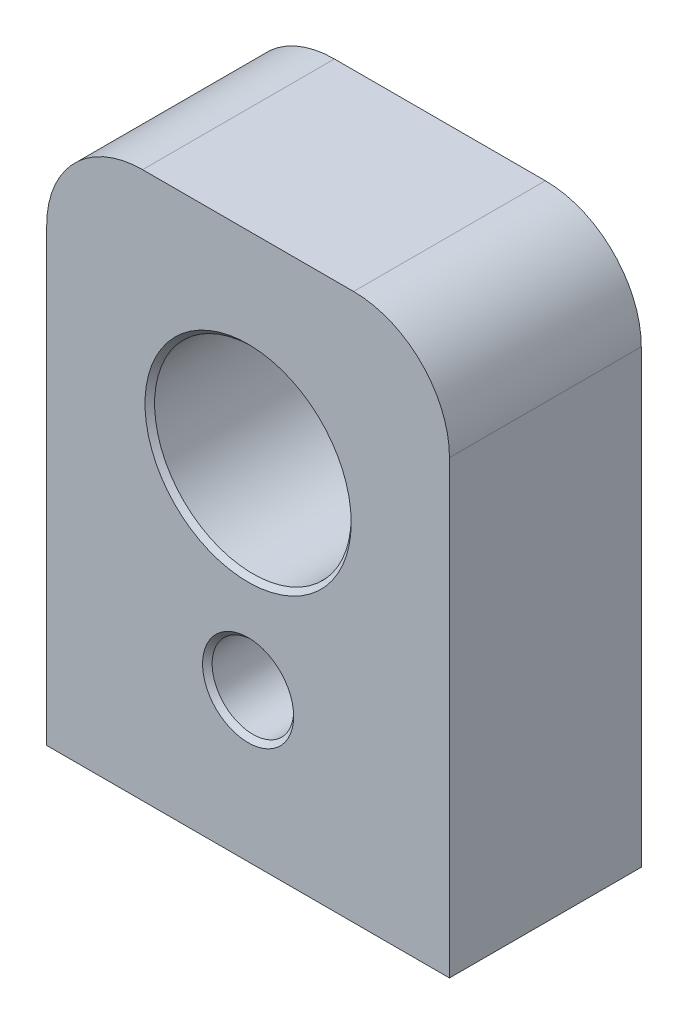
ISO-10303-21;
HEADER;
FILE_DESCRIPTION(('STEP AP214'),'2;1');
FILE_NAME('part.step','',(''),(''),'','','');
FILE_SCHEMA(('AUTOMOTIVE_DESIGN { 1 0 10303 214 1 1 1 1 }'));
ENDSEC;
DATA;
#1=APPLICATION_CONTEXT('core data for automotive mechanical design processes');
#2=APPLICATION_PROTOCOL_DEFINITION('international standard','automotive_design',2000,#1);
#3=PRODUCT_CONTEXT('',#1,'mechanical');
#4=PRODUCT('Part','Part','',(#3));
#5=PRODUCT_RELATED_PRODUCT_CATEGORY('part','',(#4));
#6=PRODUCT_DEFINITION_FORMATION('','',#4);
#7=PRODUCT_DEFINITION_CONTEXT('part definition',#1,'design');
#8=PRODUCT_DEFINITION('design','',#6,#7);
#9=PRODUCT_DEFINITION_SHAPE('','',#8);
#10=(LENGTH_UNIT() NAMED_UNIT(*) SI_UNIT(.MILLI.,.METRE.));
#11=(NAMED_UNIT(*) PLANE_ANGLE_UNIT() SI_UNIT($,.RADIAN.));
#12=(NAMED_UNIT(*) SI_UNIT($,.STERADIAN.) SOLID_ANGLE_UNIT());
#13=UNCERTAINTY_MEASURE_WITH_UNIT(LENGTH_MEASURE(1.E-05),#10,'distance_accuracy_value','');
#14=(GEOMETRIC_REPRESENTATION_CONTEXT(3) GLOBAL_UNCERTAINTY_ASSIGNED_CONTEXT((#13)) GLOBAL_UNIT_ASSIGNED_CONTEXT((#10,
#11,#12)) REPRESENTATION_CONTEXT('',''));
#15=CARTESIAN_POINT('',(0.,0.,0.));
#16=DIRECTION('',(0.,0.,1.));
#17=DIRECTION('',(1.,0.,0.));
#18=AXIS2_PLACEMENT_3D('',#15,#16,#17);
#19=CARTESIAN_POINT('',(-39.4448964809703,-26.519347405762,-10.));
#20=DIRECTION('',(0.,-1.,0.));
#21=DIRECTION('',(0.,0.,-1.));
#22=AXIS2_PLACEMENT_3D('',#19,#20,#21);
#23=PLANE('',#22);
#24=DIRECTION('',(1.,0.,0.));
#25=VECTOR('',#24,1.);
#26=CARTESIAN_POINT('',(-39.4448964809703,-26.519347405762,10.));
#27=LINE('',#26,#25);
#28=CARTESIAN_POINT('',(-39.4448964809703,-26.519347405762,10.));
#29=VERTEX_POINT('',#28);
#30=CARTESIAN_POINT('',(2.55510351902972,-26.519347405762,10.));
#31=VERTEX_POINT('',#30);
#32=EDGE_CURVE('E124',#29,#31,#27,.T.);
#33=ORIENTED_EDGE('',*,*,#32,.F.);
#34=DIRECTION('',(0.,0.,1.));
#35=VECTOR('',#34,1.);
#36=CARTESIAN_POINT('',(-39.4448964809703,-26.519347405762,-10.));
#37=LINE('',#36,#35);
#38=CARTESIAN_POINT('',(-39.4448964809703,-26.519347405762,-10.));
#39=VERTEX_POINT('',#38);
#40=EDGE_CURVE('E53',#39,#29,#37,.T.);
#41=ORIENTED_EDGE('',*,*,#40,.F.);
#42=DIRECTION('',(1.,0.,0.));
#43=VECTOR('',#42,1.);
#44=CARTESIAN_POINT('',(-39.4448964809703,-26.519347405762,-10.));
#45=LINE('',#44,#43);
#46=CARTESIAN_POINT('',(2.55510351902972,-26.519347405762,-10.));
#47=VERTEX_POINT('',#46);
#48=EDGE_CURVE('E139',#39,#47,#45,.T.);
#49=ORIENTED_EDGE('',*,*,#48,.T.);
#50=DIRECTION('',(0.,0.,1.));
#51=VECTOR('',#50,1.);
#52=CARTESIAN_POINT('',(2.55510351902972,-26.519347405762,-10.));
#53=LINE('',#52,#51);
#54=EDGE_CURVE('E88',#47,#31,#53,.T.);
#55=ORIENTED_EDGE('',*,*,#54,.T.);
#56=EDGE_LOOP('',(#33,#41,#49,#55));
#57=FACE_BOUND('',#56,.T.);
#58=ADVANCED_FACE('F35',(#57),#23,.T.);
#59=CARTESIAN_POINT('',(-39.4448964809704,20.4806525942305,-10.));
#60=DIRECTION('',(-1.,0.,0.));
#61=DIRECTION('',(0.,-1.,0.));
#62=AXIS2_PLACEMENT_3D('',#59,#60,#61);
#63=PLANE('',#62);
#64=DIRECTION('',(0.,-1.,0.));
#65=VECTOR('',#64,1.);
#66=CARTESIAN_POINT('',(-39.4448964809704,20.4806525942305,10.));
#67=LINE('',#66,#65);
#68=CARTESIAN_POINT('',(-39.4448964809704,20.4806525942305,10.));
#69=VERTEX_POINT('',#68);
#70=EDGE_CURVE('E136',#69,#29,#67,.T.);
#71=ORIENTED_EDGE('',*,*,#70,.F.);
#72=DIRECTION('',(0.,0.,1.));
#73=VECTOR('',#72,1.);
#74=CARTESIAN_POINT('',(-39.4448964809704,20.4806525942305,-10.));
#75=LINE('',#74,#73);
#76=CARTESIAN_POINT('',(-39.4448964809704,20.4806525942305,-10.));
#77=VERTEX_POINT('',#76);
#78=EDGE_CURVE('E76',#77,#69,#75,.T.);
#79=ORIENTED_EDGE('',*,*,#78,.F.);
#80=DIRECTION('',(0.,-1.,0.));
#81=VECTOR('',#80,1.);
#82=CARTESIAN_POINT('',(-39.4448964809704,20.4806525942305,-10.));
#83=LINE('',#82,#81);
#84=EDGE_CURVE('E114',#77,#39,#83,.T.);
#85=ORIENTED_EDGE('',*,*,#84,.T.);
#86=ORIENTED_EDGE('',*,*,#40,.T.);
#87=EDGE_LOOP('',(#71,#79,#85,#86));
#88=FACE_BOUND('',#87,.T.);
#89=ADVANCED_FACE('F204',(#88),#63,.T.);
#90=CARTESIAN_POINT('',(-29.4448964809704,20.4806525942305,-10.));
#91=DIRECTION('',(0.,0.,1.));
#92=DIRECTION('',(1.,0.,0.));
#93=AXIS2_PLACEMENT_3D('',#90,#91,#92);
#94=CYLINDRICAL_SURFACE('',#93,10.);
#95=CARTESIAN_POINT('',(-29.4448964809704,20.4806525942305,10.));
#96=DIRECTION('',(0.,0.,1.));
#97=DIRECTION('',(-1.,0.,0.));
#98=AXIS2_PLACEMENT_3D('',#95,#96,#97);
#99=CIRCLE('',#98,10.);
#100=CARTESIAN_POINT('',(-29.4448964809704,30.4806525942305,10.));
#101=VERTEX_POINT('',#100);
#102=EDGE_CURVE('E101',#101,#69,#99,.T.);
#103=ORIENTED_EDGE('',*,*,#102,.F.);
#104=DIRECTION('',(0.,0.,1.));
#105=VECTOR('',#104,1.);
#106=CARTESIAN_POINT('',(-29.4448964809704,30.4806525942305,-10.));
#107=LINE('',#106,#105);
#108=CARTESIAN_POINT('',(-29.4448964809704,30.4806525942305,-10.));
#109=VERTEX_POINT('',#108);
#110=EDGE_CURVE('E96',#109,#101,#107,.T.);
#111=ORIENTED_EDGE('',*,*,#110,.F.);
#112=CARTESIAN_POINT('',(-29.4448964809704,20.4806525942305,-10.));
#113=DIRECTION('',(0.,0.,1.));
#114=DIRECTION('',(-1.,0.,0.));
#115=AXIS2_PLACEMENT_3D('',#112,#113,#114);
#116=CIRCLE('',#115,10.);
#117=EDGE_CURVE('E99',#109,#77,#116,.T.);
#118=ORIENTED_EDGE('',*,*,#117,.T.);
#119=ORIENTED_EDGE('',*,*,#78,.T.);
#120=EDGE_LOOP('',(#103,#111,#118,#119));
#121=FACE_BOUND('',#120,.T.);
#122=ADVANCED_FACE('F98',(#121),#94,.T.);
#123=CARTESIAN_POINT('',(-7.44489648097042,30.4806525942305,-10.));
#124=DIRECTION('',(0.,1.,0.));
#125=DIRECTION('',(0.,0.,1.));
#126=AXIS2_PLACEMENT_3D('',#123,#124,#125);
#127=PLANE('',#126);
#128=DIRECTION('',(-1.,0.,0.));
#129=VECTOR('',#128,1.);
#130=CARTESIAN_POINT('',(-7.44489648097042,30.4806525942305,10.));
#131=LINE('',#130,#129);
#132=CARTESIAN_POINT('',(-7.44489648097042,30.4806525942305,10.));
#133=VERTEX_POINT('',#132);
#134=EDGE_CURVE('E133',#133,#101,#131,.T.);
#135=ORIENTED_EDGE('',*,*,#134,.F.);
#136=DIRECTION('',(0.,0.,1.));
#137=VECTOR('',#136,1.);
#138=CARTESIAN_POINT('',(-7.44489648097042,30.4806525942305,-10.));
#139=LINE('',#138,#137);
#140=CARTESIAN_POINT('',(-7.44489648097042,30.4806525942305,-10.));
#141=VERTEX_POINT('',#140);
#142=EDGE_CURVE('E106',#141,#133,#139,.T.);
#143=ORIENTED_EDGE('',*,*,#142,.F.);
#144=DIRECTION('',(-1.,0.,0.));
#145=VECTOR('',#144,1.);
#146=CARTESIAN_POINT('',(-7.44489648097042,30.4806525942305,-10.));
#147=LINE('',#146,#145);
#148=EDGE_CURVE('E112',#141,#109,#147,.T.);
#149=ORIENTED_EDGE('',*,*,#148,.T.);
#150=ORIENTED_EDGE('',*,*,#110,.T.);
#151=EDGE_LOOP('',(#135,#143,#149,#150));
#152=FACE_BOUND('',#151,.T.);
#153=ADVANCED_FACE('F116',(#152),#127,.T.);
#154=CARTESIAN_POINT('',(-7.44489648097042,20.4806525942305,-10.));
#155=DIRECTION('',(0.,0.,1.));
#156=DIRECTION('',(1.,0.,0.));
#157=AXIS2_PLACEMENT_3D('',#154,#155,#156);
#158=CYLINDRICAL_SURFACE('',#157,10.);
#159=CARTESIAN_POINT('',(-7.44489648097042,20.4806525942305,10.));
#160=DIRECTION('',(0.,0.,1.));
#161=DIRECTION('',(1.,0.,0.));
#162=AXIS2_PLACEMENT_3D('',#159,#160,#161);
#163=CIRCLE('',#162,10.);
#164=CARTESIAN_POINT('',(2.55510351902959,20.4806525942305,10.));
#165=VERTEX_POINT('',#164);
#166=EDGE_CURVE('E130',#165,#133,#163,.T.);
#167=ORIENTED_EDGE('',*,*,#166,.F.);
#168=DIRECTION('',(0.,0.,1.));
#169=VECTOR('',#168,1.);
#170=CARTESIAN_POINT('',(2.55510351902959,20.4806525942305,-10.));
#171=LINE('',#170,#169);
#172=CARTESIAN_POINT('',(2.55510351902959,20.4806525942305,-10.));
#173=VERTEX_POINT('',#172);
#174=EDGE_CURVE('E144',#173,#165,#171,.T.);
#175=ORIENTED_EDGE('',*,*,#174,.F.);
#176=CARTESIAN_POINT('',(-7.44489648097042,20.4806525942305,-10.));
#177=DIRECTION('',(0.,0.,1.));
#178=DIRECTION('',(1.,0.,0.));
#179=AXIS2_PLACEMENT_3D('',#176,#177,#178);
#180=CIRCLE('',#179,10.);
#181=EDGE_CURVE('E117',#173,#141,#180,.T.);
#182=ORIENTED_EDGE('',*,*,#181,.T.);
#183=ORIENTED_EDGE('',*,*,#142,.T.);
#184=EDGE_LOOP('',(#167,#175,#182,#183));
#185=FACE_BOUND('',#184,.T.);
#186=ADVANCED_FACE('F223',(#185),#158,.T.);
#187=CARTESIAN_POINT('',(2.55510351902972,-26.519347405762,-10.));
#188=DIRECTION('',(1.,0.,0.));
#189=DIRECTION('',(0.,1.,0.));
#190=AXIS2_PLACEMENT_3D('',#187,#188,#189);
#191=PLANE('',#190);
#192=DIRECTION('',(0.,1.,0.));
#193=VECTOR('',#192,1.);
#194=CARTESIAN_POINT('',(2.55510351902972,-26.519347405762,10.));
#195=LINE('',#194,#193);
#196=EDGE_CURVE('E127',#31,#165,#195,.T.);
#197=ORIENTED_EDGE('',*,*,#196,.F.);
#198=ORIENTED_EDGE('',*,*,#54,.F.);
#199=DIRECTION('',(0.,1.,0.));
#200=VECTOR('',#199,1.);
#201=CARTESIAN_POINT('',(2.55510351902972,-26.519347405762,-10.));
#202=LINE('',#201,#200);
#203=EDGE_CURVE('E119',#47,#173,#202,.T.);
#204=ORIENTED_EDGE('',*,*,#203,.T.);
#205=ORIENTED_EDGE('',*,*,#174,.T.);
#206=EDGE_LOOP('',(#197,#198,#204,#205));
#207=FACE_BOUND('',#206,.T.);
#208=ADVANCED_FACE('F188',(#207),#191,.T.);
#209=CARTESIAN_POINT('',(-7.44489648097042,20.4806525942305,-10.));
#210=DIRECTION('',(0.,0.,1.));
#211=DIRECTION('',(1.,0.,0.));
#212=AXIS2_PLACEMENT_3D('',#209,#210,#211);
#213=PLANE('',#212);
#214=CARTESIAN_POINT('',(-18.4448964809706,-11.0193474057693,-10.));
#215=DIRECTION('',(0.,0.,1.));
#216=DIRECTION('',(1.,0.,0.));
#217=AXIS2_PLACEMENT_3D('',#214,#215,#216);
#218=CIRCLE('',#217,4.75000000000001);
#219=CARTESIAN_POINT('',(-13.6948964809706,-11.0193474057693,-10.));
#220=VERTEX_POINT('',#219);
#221=EDGE_CURVE('E11',#220,#220,#218,.T.);
#222=ORIENTED_EDGE('',*,*,#221,.T.);
#223=EDGE_LOOP('',(#222));
#224=FACE_BOUND('',#223,.T.);
#225=CARTESIAN_POINT('',(-18.4448964809706,9.48065259423065,-10.));
#226=DIRECTION('',(0.,0.,1.));
#227=DIRECTION('',(1.,0.,0.));
#228=AXIS2_PLACEMENT_3D('',#225,#226,#227);
#229=CIRCLE('',#228,10.75);
#230=CARTESIAN_POINT('',(-7.69489648097064,9.48065259423065,-10.));
#231=VERTEX_POINT('',#230);
#232=EDGE_CURVE('E155',#231,#231,#229,.T.);
#233=ORIENTED_EDGE('',*,*,#232,.T.);
#234=EDGE_LOOP('',(#233));
#235=FACE_BOUND('',#234,.T.);
#236=ORIENTED_EDGE('',*,*,#48,.F.);
#237=ORIENTED_EDGE('',*,*,#84,.F.);
#238=ORIENTED_EDGE('',*,*,#117,.F.);
#239=ORIENTED_EDGE('',*,*,#148,.F.);
#240=ORIENTED_EDGE('',*,*,#181,.F.);
#241=ORIENTED_EDGE('',*,*,#203,.F.);
#242=EDGE_LOOP('',(#236,#237,#238,#239,#240,#241));
#243=FACE_BOUND('',#242,.T.);
#244=ADVANCED_FACE('F110',(#224,#235,#243),#213,.F.);
#245=CARTESIAN_POINT('',(-7.44489648097042,20.4806525942305,10.));
#246=DIRECTION('',(0.,0.,1.));
#247=DIRECTION('',(1.,0.,0.));
#248=AXIS2_PLACEMENT_3D('',#245,#246,#247);
#249=PLANE('',#248);
#250=CARTESIAN_POINT('',(-18.4448964809706,-11.0193474057693,10.));
#251=DIRECTION('',(0.,0.,1.));
#252=DIRECTION('',(1.,0.,0.));
#253=AXIS2_PLACEMENT_3D('',#250,#251,#252);
#254=CIRCLE('',#253,4.75);
#255=CARTESIAN_POINT('',(-13.6948964809706,-11.0193474057693,10.));
#256=VERTEX_POINT('',#255);
#257=EDGE_CURVE('E45',#256,#256,#254,.F.);
#258=ORIENTED_EDGE('',*,*,#257,.T.);
#259=EDGE_LOOP('',(#258));
#260=FACE_BOUND('',#259,.T.);
#261=CARTESIAN_POINT('',(-18.4448964809706,9.48065259423065,10.));
#262=DIRECTION('',(0.,0.,1.));
#263=DIRECTION('',(1.,0.,0.));
#264=AXIS2_PLACEMENT_3D('',#261,#262,#263);
#265=CIRCLE('',#264,10.75);
#266=CARTESIAN_POINT('',(-7.69489648097063,9.48065259423065,10.));
#267=VERTEX_POINT('',#266);
#268=EDGE_CURVE('E152',#267,#267,#265,.F.);
#269=ORIENTED_EDGE('',*,*,#268,.T.);
#270=EDGE_LOOP('',(#269));
#271=FACE_BOUND('',#270,.T.);
#272=ORIENTED_EDGE('',*,*,#32,.T.);
#273=ORIENTED_EDGE('',*,*,#196,.T.);
#274=ORIENTED_EDGE('',*,*,#166,.T.);
#275=ORIENTED_EDGE('',*,*,#134,.T.);
#276=ORIENTED_EDGE('',*,*,#102,.T.);
#277=ORIENTED_EDGE('',*,*,#70,.T.);
#278=EDGE_LOOP('',(#272,#273,#274,#275,#276,#277));
#279=FACE_BOUND('',#278,.T.);
#280=ADVANCED_FACE('F166',(#260,#271,#279),#249,.T.);
#281=CARTESIAN_POINT('',(-18.4448964809706,-11.0193474057693,-10.));
#282=DIRECTION('',(0.,0.,1.));
#283=DIRECTION('',(1.,0.,0.));
#284=AXIS2_PLACEMENT_3D('',#281,#282,#283);
#285=CYLINDRICAL_SURFACE('',#284,4.25);
#286=CARTESIAN_POINT('',(-18.4448964809706,-11.0193474057693,9.50000000000002));
#287=DIRECTION('',(0.,0.,1.));
#288=DIRECTION('',(1.,0.,0.));
#289=AXIS2_PLACEMENT_3D('',#286,#287,#288);
#290=CIRCLE('',#289,4.25);
#291=CARTESIAN_POINT('',(-14.1948964809706,-11.0193474057693,9.50000000000002));
#292=VERTEX_POINT('',#291);
#293=EDGE_CURVE('E161',#292,#292,#290,.T.);
#294=ORIENTED_EDGE('',*,*,#293,.T.);
#295=EDGE_LOOP('',(#294));
#296=FACE_BOUND('',#295,.T.);
#297=CARTESIAN_POINT('',(-18.4448964809706,-11.0193474057693,-9.49999999999999));
#298=DIRECTION('',(0.,0.,1.));
#299=DIRECTION('',(1.,0.,0.));
#300=AXIS2_PLACEMENT_3D('',#297,#298,#299);
#301=CIRCLE('',#300,4.25);
#302=CARTESIAN_POINT('',(-14.1948964809706,-11.0193474057693,-9.49999999999999));
#303=VERTEX_POINT('',#302);
#304=EDGE_CURVE('E158',#303,#303,#301,.F.);
#305=ORIENTED_EDGE('',*,*,#304,.T.);
#306=EDGE_LOOP('',(#305));
#307=FACE_BOUND('',#306,.T.);
#308=ADVANCED_FACE('F175',(#296,#307),#285,.F.);
#309=CARTESIAN_POINT('',(-18.4448964809706,9.48065259423065,-10.));
#310=DIRECTION('',(0.,0.,1.));
#311=DIRECTION('',(1.,0.,0.));
#312=AXIS2_PLACEMENT_3D('',#309,#310,#311);
#313=CYLINDRICAL_SURFACE('',#312,10.25);
#314=CARTESIAN_POINT('',(-18.4448964809706,9.48065259423065,9.5));
#315=DIRECTION('',(0.,0.,1.));
#316=DIRECTION('',(1.,0.,0.));
#317=AXIS2_PLACEMENT_3D('',#314,#315,#316);
#318=CIRCLE('',#317,10.25);
#319=CARTESIAN_POINT('',(-8.19489648097064,9.48065259423065,9.5));
#320=VERTEX_POINT('',#319);
#321=EDGE_CURVE('E149',#320,#320,#318,.T.);
#322=ORIENTED_EDGE('',*,*,#321,.T.);
#323=EDGE_LOOP('',(#322));
#324=FACE_BOUND('',#323,.T.);
#325=CARTESIAN_POINT('',(-18.4448964809706,9.48065259423065,-9.5));
#326=DIRECTION('',(0.,0.,1.));
#327=DIRECTION('',(1.,0.,0.));
#328=AXIS2_PLACEMENT_3D('',#325,#326,#327);
#329=CIRCLE('',#328,10.25);
#330=CARTESIAN_POINT('',(-8.19489648097064,9.48065259423065,-9.5));
#331=VERTEX_POINT('',#330);
#332=EDGE_CURVE('E141',#331,#331,#329,.F.);
#333=ORIENTED_EDGE('',*,*,#332,.T.);
#334=EDGE_LOOP('',(#333));
#335=FACE_BOUND('',#334,.T.);
#336=ADVANCED_FACE('F178',(#324,#335),#313,.F.);
#337=CARTESIAN_POINT('',(-18.4448964809706,9.48065259423065,9.5));
#338=DIRECTION('',(0.,0.,1.));
#339=DIRECTION('',(1.,0.,0.));
#340=AXIS2_PLACEMENT_3D('',#337,#338,#339);
#341=CONICAL_SURFACE('',#340,10.25,0.78539816339746);
#342=ORIENTED_EDGE('',*,*,#268,.F.);
#343=EDGE_LOOP('',(#342));
#344=FACE_BOUND('',#343,.T.);
#345=ORIENTED_EDGE('',*,*,#321,.F.);
#346=EDGE_LOOP('',(#345));
#347=FACE_BOUND('',#346,.T.);
#348=ADVANCED_FACE('F193',(#344,#347),#341,.F.);
#349=CARTESIAN_POINT('',(-18.4448964809706,9.48065259423065,-10.));
#350=DIRECTION('',(0.,0.,-1.));
#351=DIRECTION('',(-1.,0.,0.));
#352=AXIS2_PLACEMENT_3D('',#349,#350,#351);
#353=CONICAL_SURFACE('',#352,10.75,0.78539816339745);
#354=ORIENTED_EDGE('',*,*,#332,.F.);
#355=EDGE_LOOP('',(#354));
#356=FACE_BOUND('',#355,.T.);
#357=ORIENTED_EDGE('',*,*,#232,.F.);
#358=EDGE_LOOP('',(#357));
#359=FACE_BOUND('',#358,.T.);
#360=ADVANCED_FACE('F172',(#356,#359),#353,.F.);
#361=CARTESIAN_POINT('',(-18.4448964809706,-11.0193474057693,9.50000000000002));
#362=DIRECTION('',(0.,0.,1.));
#363=DIRECTION('',(1.,0.,0.));
#364=AXIS2_PLACEMENT_3D('',#361,#362,#363);
#365=CONICAL_SURFACE('',#364,4.25,0.785398163397462);
#366=ORIENTED_EDGE('',*,*,#257,.F.);
#367=EDGE_LOOP('',(#366));
#368=FACE_BOUND('',#367,.T.);
#369=ORIENTED_EDGE('',*,*,#293,.F.);
#370=EDGE_LOOP('',(#369));
#371=FACE_BOUND('',#370,.T.);
#372=ADVANCED_FACE('F169',(#368,#371),#365,.F.);
#373=CARTESIAN_POINT('',(-18.4448964809706,-11.0193474057693,-10.));
#374=DIRECTION('',(0.,0.,-1.));
#375=DIRECTION('',(-1.,0.,0.));
#376=AXIS2_PLACEMENT_3D('',#373,#374,#375);
#377=CONICAL_SURFACE('',#376,4.75000000000001,0.78539816339745);
#378=ORIENTED_EDGE('',*,*,#304,.F.);
#379=EDGE_LOOP('',(#378));
#380=FACE_BOUND('',#379,.T.);
#381=ORIENTED_EDGE('',*,*,#221,.F.);
#382=EDGE_LOOP('',(#381));
#383=FACE_BOUND('',#382,.T.);
#384=ADVANCED_FACE('F38',(#380,#383),#377,.F.);
#385=CLOSED_SHELL('',(#58,#89,#122,#153,#186,#208,#244,#280,#308,#336,#348,#360,#372,#384));
#386=MANIFOLD_SOLID_BREP('B2',#385);
#387=ADVANCED_BREP_SHAPE_REPRESENTATION('',(#18,#386),#14);
#388=SHAPE_DEFINITION_REPRESENTATION(#9,#387);
ENDSEC;
END-ISO-10303-21;
